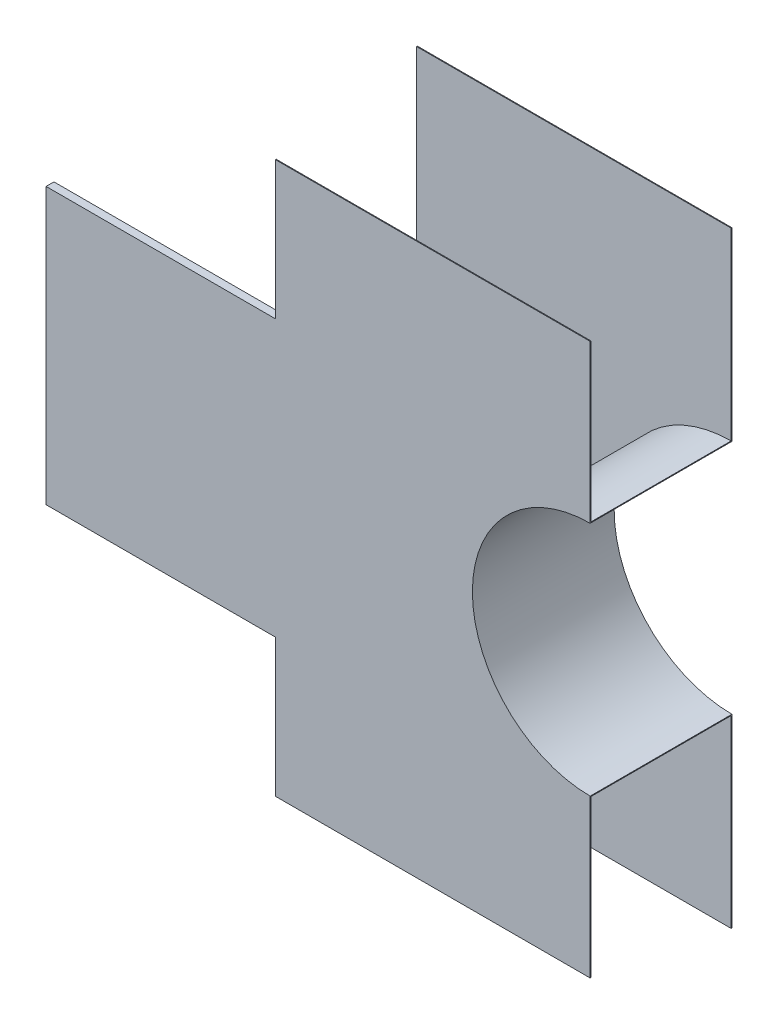
ISO-10303-21;
HEADER;
FILE_DESCRIPTION(('STEP AP214'),'2;1');
FILE_NAME('part.step','',(''),(''),'','','');
FILE_SCHEMA(('AUTOMOTIVE_DESIGN { 1 0 10303 214 1 1 1 1 }'));
ENDSEC;
DATA;
#1=APPLICATION_CONTEXT('core data for automotive mechanical design processes');
#2=APPLICATION_PROTOCOL_DEFINITION('international standard','automotive_design',2000,#1);
#3=PRODUCT_CONTEXT('',#1,'mechanical');
#4=PRODUCT('Part','Part','',(#3));
#5=PRODUCT_RELATED_PRODUCT_CATEGORY('part','',(#4));
#6=PRODUCT_DEFINITION_FORMATION('','',#4);
#7=PRODUCT_DEFINITION_CONTEXT('part definition',#1,'design');
#8=PRODUCT_DEFINITION('design','',#6,#7);
#9=PRODUCT_DEFINITION_SHAPE('','',#8);
#10=(LENGTH_UNIT() NAMED_UNIT(*) SI_UNIT(.MILLI.,.METRE.));
#11=(NAMED_UNIT(*) PLANE_ANGLE_UNIT() SI_UNIT($,.RADIAN.));
#12=(NAMED_UNIT(*) SI_UNIT($,.STERADIAN.) SOLID_ANGLE_UNIT());
#13=UNCERTAINTY_MEASURE_WITH_UNIT(LENGTH_MEASURE(1.E-05),#10,'distance_accuracy_value','');
#14=(GEOMETRIC_REPRESENTATION_CONTEXT(3) GLOBAL_UNCERTAINTY_ASSIGNED_CONTEXT((#13)) GLOBAL_UNIT_ASSIGNED_CONTEXT((#10,
#11,#12)) REPRESENTATION_CONTEXT('',''));
#15=CARTESIAN_POINT('',(0.,0.,0.));
#16=DIRECTION('',(0.,0.,1.));
#17=DIRECTION('',(1.,0.,0.));
#18=AXIS2_PLACEMENT_3D('',#15,#16,#17);
#19=CARTESIAN_POINT('',(-0.2,0.385,0.));
#20=DIRECTION('',(-1.,0.,0.));
#21=DIRECTION('',(0.,1.,0.));
#22=AXIS2_PLACEMENT_3D('',#19,#20,#21);
#23=PLANE('',#22);
#24=DIRECTION('',(0.,1.,0.));
#25=VECTOR('',#24,1.);
#26=CARTESIAN_POINT('',(-0.2,0.1925,0.001));
#27=LINE('',#26,#25);
#28=CARTESIAN_POINT('',(-0.2,-0.385,0.001));
#29=VERTEX_POINT('',#28);
#30=CARTESIAN_POINT('',(-0.2,0.385,0.001));
#31=VERTEX_POINT('',#30);
#32=EDGE_CURVE('E322',#29,#31,#27,.T.);
#33=ORIENTED_EDGE('',*,*,#32,.T.);
#34=DIRECTION('',(0.,0.,1.));
#35=VECTOR('',#34,1.);
#36=CARTESIAN_POINT('',(-0.2,0.385,0.));
#37=LINE('',#36,#35);
#38=CARTESIAN_POINT('',(-0.2,0.385,0.));
#39=VERTEX_POINT('',#38);
#40=EDGE_CURVE('E336',#39,#31,#37,.T.);
#41=ORIENTED_EDGE('',*,*,#40,.F.);
#42=DIRECTION('',(0.,1.,0.));
#43=VECTOR('',#42,1.);
#44=CARTESIAN_POINT('',(-0.2,-0.385,0.));
#45=LINE('',#44,#43);
#46=CARTESIAN_POINT('',(-0.2,-0.385,0.));
#47=VERTEX_POINT('',#46);
#48=EDGE_CURVE('E25',#47,#39,#45,.T.);
#49=ORIENTED_EDGE('',*,*,#48,.F.);
#50=DIRECTION('',(0.,0.,1.));
#51=VECTOR('',#50,1.);
#52=CARTESIAN_POINT('',(-0.2,-0.385,0.));
#53=LINE('',#52,#51);
#54=EDGE_CURVE('E11',#47,#29,#53,.T.);
#55=ORIENTED_EDGE('',*,*,#54,.T.);
#56=EDGE_LOOP('',(#33,#41,#49,#55));
#57=FACE_BOUND('',#56,.T.);
#58=ADVANCED_FACE('F17',(#57),#23,.T.);
#59=CARTESIAN_POINT('',(-0.2,-0.385,0.));
#60=DIRECTION('',(0.,-1.,0.));
#61=DIRECTION('',(-1.,0.,0.));
#62=AXIS2_PLACEMENT_3D('',#59,#60,#61);
#63=PLANE('',#62);
#64=DIRECTION('',(-1.,0.,0.));
#65=VECTOR('',#64,1.);
#66=CARTESIAN_POINT('',(-0.104818284477,-0.385,0.001));
#67=LINE('',#66,#65);
#68=CARTESIAN_POINT('',(0.1995,-0.385,0.001));
#69=VERTEX_POINT('',#68);
#70=EDGE_CURVE('E278',#69,#29,#67,.T.);
#71=ORIENTED_EDGE('',*,*,#70,.T.);
#72=ORIENTED_EDGE('',*,*,#54,.F.);
#73=DIRECTION('',(-1.,0.,0.));
#74=VECTOR('',#73,1.);
#75=CARTESIAN_POINT('',(0.2,-0.385,0.));
#76=LINE('',#75,#74);
#77=CARTESIAN_POINT('',(0.1995,-0.385,0.));
#78=VERTEX_POINT('',#77);
#79=EDGE_CURVE('E338',#78,#47,#76,.T.);
#80=ORIENTED_EDGE('',*,*,#79,.F.);
#81=DIRECTION('',(0.,0.,1.));
#82=VECTOR('',#81,1.);
#83=CARTESIAN_POINT('',(0.1995,-0.385,0.));
#84=LINE('',#83,#82);
#85=EDGE_CURVE('E287',#78,#69,#84,.T.);
#86=ORIENTED_EDGE('',*,*,#85,.T.);
#87=EDGE_LOOP('',(#71,#72,#80,#86));
#88=FACE_BOUND('',#87,.T.);
#89=ADVANCED_FACE('F400',(#88),#63,.T.);
#90=CARTESIAN_POINT('',(-0.009636568954392,0.,0.));
#91=DIRECTION('',(0.,0.,1.));
#92=DIRECTION('',(1.,0.,0.));
#93=AXIS2_PLACEMENT_3D('',#90,#91,#92);
#94=PLANE('',#93);
#95=DIRECTION('',(0.,-1.,0.));
#96=VECTOR('',#95,1.);
#97=CARTESIAN_POINT('',(0.1995,0.2,0.));
#98=LINE('',#97,#96);
#99=CARTESIAN_POINT('',(0.1995,-0.149999166664,0.));
#100=VERTEX_POINT('',#99);
#101=EDGE_CURVE('E283',#100,#78,#98,.T.);
#102=ORIENTED_EDGE('',*,*,#101,.T.);
#103=ORIENTED_EDGE('',*,*,#79,.T.);
#104=ORIENTED_EDGE('',*,*,#48,.T.);
#105=DIRECTION('',(1.,0.,0.));
#106=VECTOR('',#105,1.);
#107=CARTESIAN_POINT('',(-0.2,0.385,0.));
#108=LINE('',#107,#106);
#109=CARTESIAN_POINT('',(0.1995,0.385,0.));
#110=VERTEX_POINT('',#109);
#111=EDGE_CURVE('E226',#39,#110,#108,.T.);
#112=ORIENTED_EDGE('',*,*,#111,.T.);
#113=DIRECTION('',(0.,-1.,0.));
#114=VECTOR('',#113,1.);
#115=CARTESIAN_POINT('',(0.1995,0.2,0.));
#116=LINE('',#115,#114);
#117=CARTESIAN_POINT('',(0.1995,0.149999166664,0.));
#118=VERTEX_POINT('',#117);
#119=EDGE_CURVE('E330',#110,#118,#116,.T.);
#120=ORIENTED_EDGE('',*,*,#119,.T.);
#121=CARTESIAN_POINT('',(0.2,0.,0.));
#122=DIRECTION('',(0.,0.,1.));
#123=DIRECTION('',(0.,1.,0.));
#124=AXIS2_PLACEMENT_3D('',#121,#122,#123);
#125=CIRCLE('',#124,0.15);
#126=EDGE_CURVE('E223',#118,#100,#125,.T.);
#127=ORIENTED_EDGE('',*,*,#126,.T.);
#128=EDGE_LOOP('',(#102,#103,#104,#112,#120,#127));
#129=FACE_BOUND('',#128,.T.);
#130=ADVANCED_FACE('F386',(#129),#94,.F.);
#131=CARTESIAN_POINT('',(0.2,0.385,0.));
#132=DIRECTION('',(0.,1.,0.));
#133=DIRECTION('',(1.,0.,0.));
#134=AXIS2_PLACEMENT_3D('',#131,#132,#133);
#135=PLANE('',#134);
#136=DIRECTION('',(1.,0.,0.));
#137=VECTOR('',#136,1.);
#138=CARTESIAN_POINT('',(0.0951817155228,0.385,0.001));
#139=LINE('',#138,#137);
#140=CARTESIAN_POINT('',(0.1995,0.385,0.001));
#141=VERTEX_POINT('',#140);
#142=EDGE_CURVE('E255',#31,#141,#139,.T.);
#143=ORIENTED_EDGE('',*,*,#142,.T.);
#144=DIRECTION('',(0.,0.,-1.));
#145=VECTOR('',#144,1.);
#146=CARTESIAN_POINT('',(0.1995,0.385,0.));
#147=LINE('',#146,#145);
#148=EDGE_CURVE('E227',#141,#110,#147,.T.);
#149=ORIENTED_EDGE('',*,*,#148,.T.);
#150=ORIENTED_EDGE('',*,*,#111,.F.);
#151=ORIENTED_EDGE('',*,*,#40,.T.);
#152=EDGE_LOOP('',(#143,#149,#150,#151));
#153=FACE_BOUND('',#152,.T.);
#154=ADVANCED_FACE('F408',(#153),#135,.T.);
#155=CARTESIAN_POINT('',(0.2,0.,0.));
#156=DIRECTION('',(0.,0.,1.));
#157=DIRECTION('',(0.,1.,0.));
#158=AXIS2_PLACEMENT_3D('',#155,#156,#157);
#159=CYLINDRICAL_SURFACE('',#158,0.15);
#160=DIRECTION('',(0.,0.,-1.));
#161=VECTOR('',#160,1.);
#162=CARTESIAN_POINT('',(0.1995,-0.149999166664,0.));
#163=LINE('',#162,#161);
#164=CARTESIAN_POINT('',(0.1995,-0.149999166664,0.18));
#165=VERTEX_POINT('',#164);
#166=EDGE_CURVE('E282',#165,#100,#163,.T.);
#167=ORIENTED_EDGE('',*,*,#166,.T.);
#168=ORIENTED_EDGE('',*,*,#126,.F.);
#169=DIRECTION('',(0.,0.,1.));
#170=VECTOR('',#169,1.);
#171=CARTESIAN_POINT('',(0.1995,0.149999166664,0.));
#172=LINE('',#171,#170);
#173=CARTESIAN_POINT('',(0.1995,0.149999166664,0.18));
#174=VERTEX_POINT('',#173);
#175=EDGE_CURVE('E277',#118,#174,#172,.T.);
#176=ORIENTED_EDGE('',*,*,#175,.T.);
#177=CARTESIAN_POINT('',(0.2,0.,0.18));
#178=DIRECTION('',(0.,0.,-1.));
#179=DIRECTION('',(0.,1.,0.));
#180=AXIS2_PLACEMENT_3D('',#177,#178,#179);
#181=CIRCLE('',#180,0.15);
#182=EDGE_CURVE('E252',#165,#174,#181,.T.);
#183=ORIENTED_EDGE('',*,*,#182,.F.);
#184=EDGE_LOOP('',(#167,#168,#176,#183));
#185=FACE_BOUND('',#184,.T.);
#186=ADVANCED_FACE('F393',(#185),#159,.F.);
#187=CARTESIAN_POINT('',(0.1995,0.4,0.));
#188=DIRECTION('',(-1.,0.,0.));
#189=DIRECTION('',(0.,0.,1.));
#190=AXIS2_PLACEMENT_3D('',#187,#188,#189);
#191=PLANE('',#190);
#192=DIRECTION('',(0.,0.,1.));
#193=VECTOR('',#192,1.);
#194=CARTESIAN_POINT('',(0.1995,0.35,0.09));
#195=LINE('',#194,#193);
#196=CARTESIAN_POINT('',(0.1995,0.35,0.179));
#197=VERTEX_POINT('',#196);
#198=CARTESIAN_POINT('',(0.1995,0.35,0.18));
#199=VERTEX_POINT('',#198);
#200=EDGE_CURVE('E291',#197,#199,#195,.T.);
#201=ORIENTED_EDGE('',*,*,#200,.T.);
#202=DIRECTION('',(0.,1.,0.));
#203=VECTOR('',#202,1.);
#204=CARTESIAN_POINT('',(0.1995,0.2,0.18));
#205=LINE('',#204,#203);
#206=EDGE_CURVE('E259',#174,#199,#205,.T.);
#207=ORIENTED_EDGE('',*,*,#206,.F.);
#208=ORIENTED_EDGE('',*,*,#175,.F.);
#209=ORIENTED_EDGE('',*,*,#119,.F.);
#210=ORIENTED_EDGE('',*,*,#148,.F.);
#211=DIRECTION('',(0.,-1.,0.));
#212=VECTOR('',#211,1.);
#213=CARTESIAN_POINT('',(0.1995,0.2,0.001));
#214=LINE('',#213,#212);
#215=CARTESIAN_POINT('',(0.1995,0.150999172208,0.001));
#216=VERTEX_POINT('',#215);
#217=EDGE_CURVE('E247',#141,#216,#214,.T.);
#218=ORIENTED_EDGE('',*,*,#217,.T.);
#219=DIRECTION('',(0.,0.,1.));
#220=VECTOR('',#219,1.);
#221=CARTESIAN_POINT('',(0.1995,0.150999172183,0.));
#222=LINE('',#221,#220);
#223=CARTESIAN_POINT('',(0.1995,0.150999172208,0.179));
#224=VERTEX_POINT('',#223);
#225=EDGE_CURVE('E248',#216,#224,#222,.T.);
#226=ORIENTED_EDGE('',*,*,#225,.T.);
#227=DIRECTION('',(0.,1.,0.));
#228=VECTOR('',#227,1.);
#229=CARTESIAN_POINT('',(0.1995,0.2,0.179));
#230=LINE('',#229,#228);
#231=EDGE_CURVE('E274',#224,#197,#230,.T.);
#232=ORIENTED_EDGE('',*,*,#231,.T.);
#233=EDGE_LOOP('',(#201,#207,#208,#209,#210,#218,#226,#232));
#234=FACE_BOUND('',#233,.T.);
#235=ADVANCED_FACE('F390',(#234),#191,.F.);
#236=CARTESIAN_POINT('',(-0.009636568954392,0.,0.179));
#237=DIRECTION('',(0.,0.,1.));
#238=DIRECTION('',(1.,0.,0.));
#239=AXIS2_PLACEMENT_3D('',#236,#237,#238);
#240=PLANE('',#239);
#241=DIRECTION('',(-1.,0.,0.));
#242=VECTOR('',#241,1.);
#243=CARTESIAN_POINT('',(-0.250445031209,0.175,0.179));
#244=LINE('',#243,#242);
#245=CARTESIAN_POINT('',(-0.09125349346398,0.175,0.179));
#246=VERTEX_POINT('',#245);
#247=CARTESIAN_POINT('',(-0.2,0.175,0.179));
#248=VERTEX_POINT('',#247);
#249=EDGE_CURVE('E350',#246,#248,#244,.T.);
#250=ORIENTED_EDGE('',*,*,#249,.T.);
#251=DIRECTION('',(0.,-1.,0.));
#252=VECTOR('',#251,1.);
#253=CARTESIAN_POINT('',(-0.2,0.1925,0.179));
#254=LINE('',#253,#252);
#255=CARTESIAN_POINT('',(-0.2,0.35,0.179));
#256=VERTEX_POINT('',#255);
#257=EDGE_CURVE('E301',#256,#248,#254,.T.);
#258=ORIENTED_EDGE('',*,*,#257,.F.);
#259=DIRECTION('',(1.,0.,0.));
#260=VECTOR('',#259,1.);
#261=CARTESIAN_POINT('',(0.09493171552281,0.35,0.179));
#262=LINE('',#261,#260);
#263=EDGE_CURVE('E269',#256,#197,#262,.T.);
#264=ORIENTED_EDGE('',*,*,#263,.T.);
#265=ORIENTED_EDGE('',*,*,#231,.F.);
#266=CARTESIAN_POINT('',(0.2,0.,0.179));
#267=DIRECTION('',(0.,0.,1.));
#268=DIRECTION('',(0.,1.,0.));
#269=AXIS2_PLACEMENT_3D('',#266,#267,#268);
#270=CIRCLE('',#269,0.151);
#271=CARTESIAN_POINT('',(0.1995,-0.150999172208,0.179));
#272=VERTEX_POINT('',#271);
#273=EDGE_CURVE('E279',#224,#272,#270,.T.);
#274=ORIENTED_EDGE('',*,*,#273,.T.);
#275=DIRECTION('',(0.,1.,0.));
#276=VECTOR('',#275,1.);
#277=CARTESIAN_POINT('',(0.1995,0.2,0.179));
#278=LINE('',#277,#276);
#279=CARTESIAN_POINT('',(0.1995,-0.35,0.179));
#280=VERTEX_POINT('',#279);
#281=EDGE_CURVE('E304',#280,#272,#278,.T.);
#282=ORIENTED_EDGE('',*,*,#281,.F.);
#283=DIRECTION('',(-1.,0.,0.));
#284=VECTOR('',#283,1.);
#285=CARTESIAN_POINT('',(-0.104818284477,-0.35,0.179));
#286=LINE('',#285,#284);
#287=CARTESIAN_POINT('',(-0.2,-0.35,0.179));
#288=VERTEX_POINT('',#287);
#289=EDGE_CURVE('E294',#280,#288,#286,.T.);
#290=ORIENTED_EDGE('',*,*,#289,.T.);
#291=DIRECTION('',(0.,-1.,0.));
#292=VECTOR('',#291,1.);
#293=CARTESIAN_POINT('',(-0.2,0.1925,0.179));
#294=LINE('',#293,#292);
#295=CARTESIAN_POINT('',(-0.2,-0.175,0.179));
#296=VERTEX_POINT('',#295);
#297=EDGE_CURVE('E230',#296,#288,#294,.T.);
#298=ORIENTED_EDGE('',*,*,#297,.F.);
#299=DIRECTION('',(1.,0.,0.));
#300=VECTOR('',#299,1.);
#301=CARTESIAN_POINT('',(-0.05044503120919,-0.175,0.179));
#302=LINE('',#301,#300);
#303=CARTESIAN_POINT('',(-0.09125349346398,-0.175,0.179));
#304=VERTEX_POINT('',#303);
#305=EDGE_CURVE('E192',#296,#304,#302,.T.);
#306=ORIENTED_EDGE('',*,*,#305,.T.);
#307=DIRECTION('',(0.,1.,0.));
#308=VECTOR('',#307,1.);
#309=CARTESIAN_POINT('',(-0.09125349346398,0.0875,0.179));
#310=LINE('',#309,#308);
#311=EDGE_CURVE('E378',#304,#246,#310,.T.);
#312=ORIENTED_EDGE('',*,*,#311,.T.);
#313=EDGE_LOOP('',(#250,#258,#264,#265,#274,#282,#290,#298,#306,#312));
#314=FACE_BOUND('',#313,.T.);
#315=ADVANCED_FACE('F416',(#314),#240,.F.);
#316=CARTESIAN_POINT('',(-0.009636568954392,0.,0.001));
#317=DIRECTION('',(0.,0.,1.));
#318=DIRECTION('',(1.,0.,0.));
#319=AXIS2_PLACEMENT_3D('',#316,#317,#318);
#320=PLANE('',#319);
#321=DIRECTION('',(0.,-1.,0.));
#322=VECTOR('',#321,1.);
#323=CARTESIAN_POINT('',(0.1995,0.2,0.001));
#324=LINE('',#323,#322);
#325=CARTESIAN_POINT('',(0.1995,-0.150999172208,0.001));
#326=VERTEX_POINT('',#325);
#327=EDGE_CURVE('E312',#326,#69,#324,.T.);
#328=ORIENTED_EDGE('',*,*,#327,.F.);
#329=CARTESIAN_POINT('',(0.2,0.,0.001));
#330=DIRECTION('',(0.,0.,1.));
#331=DIRECTION('',(0.,1.,0.));
#332=AXIS2_PLACEMENT_3D('',#329,#330,#331);
#333=CIRCLE('',#332,0.151);
#334=EDGE_CURVE('E244',#216,#326,#333,.T.);
#335=ORIENTED_EDGE('',*,*,#334,.F.);
#336=ORIENTED_EDGE('',*,*,#217,.F.);
#337=ORIENTED_EDGE('',*,*,#142,.F.);
#338=ORIENTED_EDGE('',*,*,#32,.F.);
#339=ORIENTED_EDGE('',*,*,#70,.F.);
#340=EDGE_LOOP('',(#328,#335,#336,#337,#338,#339));
#341=FACE_BOUND('',#340,.T.);
#342=ADVANCED_FACE('F404',(#341),#320,.T.);
#343=CARTESIAN_POINT('',(0.2,0.,0.));
#344=DIRECTION('',(0.,0.,1.));
#345=DIRECTION('',(0.,1.,0.));
#346=AXIS2_PLACEMENT_3D('',#343,#344,#345);
#347=CYLINDRICAL_SURFACE('',#346,0.151);
#348=DIRECTION('',(0.,0.,-1.));
#349=VECTOR('',#348,1.);
#350=CARTESIAN_POINT('',(0.1995,-0.150999172183,0.));
#351=LINE('',#350,#349);
#352=EDGE_CURVE('E308',#272,#326,#351,.T.);
#353=ORIENTED_EDGE('',*,*,#352,.F.);
#354=ORIENTED_EDGE('',*,*,#273,.F.);
#355=ORIENTED_EDGE('',*,*,#225,.F.);
#356=ORIENTED_EDGE('',*,*,#334,.T.);
#357=EDGE_LOOP('',(#353,#354,#355,#356));
#358=FACE_BOUND('',#357,.T.);
#359=ADVANCED_FACE('F414',(#358),#347,.T.);
#360=CARTESIAN_POINT('',(0.1995,0.4,0.));
#361=DIRECTION('',(-1.,0.,0.));
#362=DIRECTION('',(0.,0.,1.));
#363=AXIS2_PLACEMENT_3D('',#360,#361,#362);
#364=PLANE('',#363);
#365=DIRECTION('',(0.,0.,-1.));
#366=VECTOR('',#365,1.);
#367=CARTESIAN_POINT('',(0.1995,-0.35,0.09));
#368=LINE('',#367,#366);
#369=CARTESIAN_POINT('',(0.1995,-0.35,0.18));
#370=VERTEX_POINT('',#369);
#371=EDGE_CURVE('E297',#370,#280,#368,.T.);
#372=ORIENTED_EDGE('',*,*,#371,.T.);
#373=ORIENTED_EDGE('',*,*,#281,.T.);
#374=ORIENTED_EDGE('',*,*,#352,.T.);
#375=ORIENTED_EDGE('',*,*,#327,.T.);
#376=ORIENTED_EDGE('',*,*,#85,.F.);
#377=ORIENTED_EDGE('',*,*,#101,.F.);
#378=ORIENTED_EDGE('',*,*,#166,.F.);
#379=DIRECTION('',(0.,1.,0.));
#380=VECTOR('',#379,1.);
#381=CARTESIAN_POINT('',(0.1995,0.2,0.18));
#382=LINE('',#381,#380);
#383=EDGE_CURVE('E243',#370,#165,#382,.T.);
#384=ORIENTED_EDGE('',*,*,#383,.F.);
#385=EDGE_LOOP('',(#372,#373,#374,#375,#376,#377,#378,#384));
#386=FACE_BOUND('',#385,.T.);
#387=ADVANCED_FACE('F398',(#386),#364,.F.);
#388=CARTESIAN_POINT('',(-0.2,0.385,0.));
#389=DIRECTION('',(-1.,0.,0.));
#390=DIRECTION('',(0.,1.,0.));
#391=AXIS2_PLACEMENT_3D('',#388,#389,#390);
#392=PLANE('',#391);
#393=DIRECTION('',(0.,0.,1.));
#394=VECTOR('',#393,1.);
#395=CARTESIAN_POINT('',(-0.2,0.175,0.09));
#396=LINE('',#395,#394);
#397=CARTESIAN_POINT('',(-0.2,0.175,0.18));
#398=VERTEX_POINT('',#397);
#399=EDGE_CURVE('E355',#248,#398,#396,.T.);
#400=ORIENTED_EDGE('',*,*,#399,.T.);
#401=DIRECTION('',(0.,-1.,0.));
#402=VECTOR('',#401,1.);
#403=CARTESIAN_POINT('',(-0.2,-0.385,0.18));
#404=LINE('',#403,#402);
#405=CARTESIAN_POINT('',(-0.2,0.35,0.18));
#406=VERTEX_POINT('',#405);
#407=EDGE_CURVE('E228',#406,#398,#404,.T.);
#408=ORIENTED_EDGE('',*,*,#407,.F.);
#409=DIRECTION('',(0.,0.,-1.));
#410=VECTOR('',#409,1.);
#411=CARTESIAN_POINT('',(-0.2,0.35,0.09));
#412=LINE('',#411,#410);
#413=EDGE_CURVE('E273',#406,#256,#412,.T.);
#414=ORIENTED_EDGE('',*,*,#413,.T.);
#415=ORIENTED_EDGE('',*,*,#257,.T.);
#416=EDGE_LOOP('',(#400,#408,#414,#415));
#417=FACE_BOUND('',#416,.T.);
#418=ADVANCED_FACE('F481',(#417),#392,.T.);
#419=CARTESIAN_POINT('',(-0.2,-0.35,0.18));
#420=DIRECTION('',(0.,1.,0.));
#421=DIRECTION('',(1.,0.,0.));
#422=AXIS2_PLACEMENT_3D('',#419,#420,#421);
#423=PLANE('',#422);
#424=ORIENTED_EDGE('',*,*,#289,.F.);
#425=ORIENTED_EDGE('',*,*,#371,.F.);
#426=DIRECTION('',(1.,0.,0.));
#427=VECTOR('',#426,1.);
#428=CARTESIAN_POINT('',(-0.104818284477,-0.35,0.18));
#429=LINE('',#428,#427);
#430=CARTESIAN_POINT('',(-0.2,-0.35,0.18));
#431=VERTEX_POINT('',#430);
#432=EDGE_CURVE('E239',#431,#370,#429,.T.);
#433=ORIENTED_EDGE('',*,*,#432,.F.);
#434=DIRECTION('',(0.,0.,1.));
#435=VECTOR('',#434,1.);
#436=CARTESIAN_POINT('',(-0.2,-0.35,0.09));
#437=LINE('',#436,#435);
#438=EDGE_CURVE('E266',#288,#431,#437,.T.);
#439=ORIENTED_EDGE('',*,*,#438,.F.);
#440=EDGE_LOOP('',(#424,#425,#433,#439));
#441=FACE_BOUND('',#440,.T.);
#442=ADVANCED_FACE('F429',(#441),#423,.F.);
#443=CARTESIAN_POINT('',(0.1995,0.35,0.18));
#444=DIRECTION('',(0.,-1.,0.));
#445=DIRECTION('',(0.,0.,-1.));
#446=AXIS2_PLACEMENT_3D('',#443,#444,#445);
#447=PLANE('',#446);
#448=ORIENTED_EDGE('',*,*,#263,.F.);
#449=ORIENTED_EDGE('',*,*,#413,.F.);
#450=DIRECTION('',(-1.,0.,0.));
#451=VECTOR('',#450,1.);
#452=CARTESIAN_POINT('',(0.09493171552281,0.35,0.18));
#453=LINE('',#452,#451);
#454=EDGE_CURVE('E231',#199,#406,#453,.T.);
#455=ORIENTED_EDGE('',*,*,#454,.F.);
#456=ORIENTED_EDGE('',*,*,#200,.F.);
#457=EDGE_LOOP('',(#448,#449,#455,#456));
#458=FACE_BOUND('',#457,.T.);
#459=ADVANCED_FACE('F421',(#458),#447,.F.);
#460=CARTESIAN_POINT('',(-0.2,0.385,0.));
#461=DIRECTION('',(-1.,0.,0.));
#462=DIRECTION('',(0.,1.,0.));
#463=AXIS2_PLACEMENT_3D('',#460,#461,#462);
#464=PLANE('',#463);
#465=DIRECTION('',(0.,0.,-1.));
#466=VECTOR('',#465,1.);
#467=CARTESIAN_POINT('',(-0.2,-0.175,0.09));
#468=LINE('',#467,#466);
#469=CARTESIAN_POINT('',(-0.2,-0.175,0.18));
#470=VERTEX_POINT('',#469);
#471=EDGE_CURVE('E203',#470,#296,#468,.T.);
#472=ORIENTED_EDGE('',*,*,#471,.T.);
#473=ORIENTED_EDGE('',*,*,#297,.T.);
#474=ORIENTED_EDGE('',*,*,#438,.T.);
#475=DIRECTION('',(0.,-1.,0.));
#476=VECTOR('',#475,1.);
#477=CARTESIAN_POINT('',(-0.2,-0.385,0.18));
#478=LINE('',#477,#476);
#479=EDGE_CURVE('E235',#470,#431,#478,.T.);
#480=ORIENTED_EDGE('',*,*,#479,.F.);
#481=EDGE_LOOP('',(#472,#473,#474,#480));
#482=FACE_BOUND('',#481,.T.);
#483=ADVANCED_FACE('F433',(#482),#464,.T.);
#484=CARTESIAN_POINT('',(-0.009636568954392,0.,0.18));
#485=DIRECTION('',(0.,0.,1.));
#486=DIRECTION('',(1.,0.,0.));
#487=AXIS2_PLACEMENT_3D('',#484,#485,#486);
#488=PLANE('',#487);
#489=ORIENTED_EDGE('',*,*,#479,.T.);
#490=ORIENTED_EDGE('',*,*,#432,.T.);
#491=ORIENTED_EDGE('',*,*,#383,.T.);
#492=ORIENTED_EDGE('',*,*,#182,.T.);
#493=ORIENTED_EDGE('',*,*,#206,.T.);
#494=ORIENTED_EDGE('',*,*,#454,.T.);
#495=ORIENTED_EDGE('',*,*,#407,.T.);
#496=DIRECTION('',(1.,0.,0.));
#497=VECTOR('',#496,1.);
#498=CARTESIAN_POINT('',(-0.491253493464,0.175,0.18));
#499=LINE('',#498,#497);
#500=CARTESIAN_POINT('',(-0.491253493464,0.175,0.18));
#501=VERTEX_POINT('',#500);
#502=EDGE_CURVE('E348',#501,#398,#499,.T.);
#503=ORIENTED_EDGE('',*,*,#502,.F.);
#504=DIRECTION('',(0.,1.,0.));
#505=VECTOR('',#504,1.);
#506=CARTESIAN_POINT('',(-0.491253493464,-0.175,0.18));
#507=LINE('',#506,#505);
#508=CARTESIAN_POINT('',(-0.491253493464,-0.175,0.18));
#509=VERTEX_POINT('',#508);
#510=EDGE_CURVE('E210',#509,#501,#507,.T.);
#511=ORIENTED_EDGE('',*,*,#510,.F.);
#512=DIRECTION('',(-1.,0.,0.));
#513=VECTOR('',#512,1.);
#514=CARTESIAN_POINT('',(-0.09125349346398,-0.175,0.18));
#515=LINE('',#514,#513);
#516=EDGE_CURVE('E193',#470,#509,#515,.T.);
#517=ORIENTED_EDGE('',*,*,#516,.F.);
#518=EDGE_LOOP('',(#489,#490,#491,#492,#493,#494,#495,#503,#511,#517));
#519=FACE_BOUND('',#518,.T.);
#520=ADVANCED_FACE('F424',(#519),#488,.T.);
#521=CARTESIAN_POINT('',(-0.291253493464,0.,0.17));
#522=DIRECTION('',(0.,0.,-1.));
#523=DIRECTION('',(0.,-1.,0.));
#524=AXIS2_PLACEMENT_3D('',#521,#522,#523);
#525=PLANE('',#524);
#526=DIRECTION('',(-1.,0.,0.));
#527=VECTOR('',#526,1.);
#528=CARTESIAN_POINT('',(-0.09125349346398,-0.175,0.17));
#529=LINE('',#528,#527);
#530=CARTESIAN_POINT('',(-0.09125349346398,-0.175,0.17));
#531=VERTEX_POINT('',#530);
#532=CARTESIAN_POINT('',(-0.491253493464,-0.175,0.17));
#533=VERTEX_POINT('',#532);
#534=EDGE_CURVE('E180',#531,#533,#529,.T.);
#535=ORIENTED_EDGE('',*,*,#534,.T.);
#536=DIRECTION('',(0.,1.,0.));
#537=VECTOR('',#536,1.);
#538=CARTESIAN_POINT('',(-0.491253493464,-0.175,0.17));
#539=LINE('',#538,#537);
#540=CARTESIAN_POINT('',(-0.491253493464,0.175,0.17));
#541=VERTEX_POINT('',#540);
#542=EDGE_CURVE('E185',#533,#541,#539,.T.);
#543=ORIENTED_EDGE('',*,*,#542,.T.);
#544=DIRECTION('',(1.,0.,0.));
#545=VECTOR('',#544,1.);
#546=CARTESIAN_POINT('',(-0.491253493464,0.175,0.17));
#547=LINE('',#546,#545);
#548=CARTESIAN_POINT('',(-0.09125349346398,0.175,0.17));
#549=VERTEX_POINT('',#548);
#550=EDGE_CURVE('E358',#541,#549,#547,.T.);
#551=ORIENTED_EDGE('',*,*,#550,.T.);
#552=DIRECTION('',(0.,-1.,0.));
#553=VECTOR('',#552,1.);
#554=CARTESIAN_POINT('',(-0.09125349346398,0.175,0.17));
#555=LINE('',#554,#553);
#556=EDGE_CURVE('E187',#549,#531,#555,.T.);
#557=ORIENTED_EDGE('',*,*,#556,.T.);
#558=EDGE_LOOP('',(#535,#543,#551,#557));
#559=FACE_BOUND('',#558,.T.);
#560=ADVANCED_FACE('F182',(#559),#525,.T.);
#561=CARTESIAN_POINT('',(-0.09125349346398,-0.175,0.18));
#562=DIRECTION('',(0.,-1.,0.));
#563=DIRECTION('',(0.,0.,-1.));
#564=AXIS2_PLACEMENT_3D('',#561,#562,#563);
#565=PLANE('',#564);
#566=ORIENTED_EDGE('',*,*,#471,.F.);
#567=ORIENTED_EDGE('',*,*,#516,.T.);
#568=DIRECTION('',(0.,0.,-1.));
#569=VECTOR('',#568,1.);
#570=CARTESIAN_POINT('',(-0.491253493464,-0.175,0.18));
#571=LINE('',#570,#569);
#572=EDGE_CURVE('E196',#509,#533,#571,.T.);
#573=ORIENTED_EDGE('',*,*,#572,.T.);
#574=ORIENTED_EDGE('',*,*,#534,.F.);
#575=DIRECTION('',(0.,0.,-1.));
#576=VECTOR('',#575,1.);
#577=CARTESIAN_POINT('',(-0.09125349346398,-0.175,0.18));
#578=LINE('',#577,#576);
#579=EDGE_CURVE('E219',#304,#531,#578,.T.);
#580=ORIENTED_EDGE('',*,*,#579,.F.);
#581=ORIENTED_EDGE('',*,*,#305,.F.);
#582=EDGE_LOOP('',(#566,#567,#573,#574,#580,#581));
#583=FACE_BOUND('',#582,.T.);
#584=ADVANCED_FACE('F198',(#583),#565,.T.);
#585=CARTESIAN_POINT('',(-0.491253493464,-0.175,0.18));
#586=DIRECTION('',(-1.,0.,0.));
#587=DIRECTION('',(0.,0.,1.));
#588=AXIS2_PLACEMENT_3D('',#585,#586,#587);
#589=PLANE('',#588);
#590=ORIENTED_EDGE('',*,*,#510,.T.);
#591=DIRECTION('',(0.,0.,-1.));
#592=VECTOR('',#591,1.);
#593=CARTESIAN_POINT('',(-0.491253493464,0.175,0.18));
#594=LINE('',#593,#592);
#595=EDGE_CURVE('E207',#501,#541,#594,.T.);
#596=ORIENTED_EDGE('',*,*,#595,.T.);
#597=ORIENTED_EDGE('',*,*,#542,.F.);
#598=ORIENTED_EDGE('',*,*,#572,.F.);
#599=EDGE_LOOP('',(#590,#596,#597,#598));
#600=FACE_BOUND('',#599,.T.);
#601=ADVANCED_FACE('F205',(#600),#589,.T.);
#602=CARTESIAN_POINT('',(-0.09125349346398,0.175,0.18));
#603=DIRECTION('',(1.,0.,0.));
#604=DIRECTION('',(0.,1.,0.));
#605=AXIS2_PLACEMENT_3D('',#602,#603,#604);
#606=PLANE('',#605);
#607=ORIENTED_EDGE('',*,*,#311,.F.);
#608=ORIENTED_EDGE('',*,*,#579,.T.);
#609=ORIENTED_EDGE('',*,*,#556,.F.);
#610=DIRECTION('',(0.,0.,-1.));
#611=VECTOR('',#610,1.);
#612=CARTESIAN_POINT('',(-0.09125349346398,0.175,0.18));
#613=LINE('',#612,#611);
#614=EDGE_CURVE('E354',#246,#549,#613,.T.);
#615=ORIENTED_EDGE('',*,*,#614,.F.);
#616=EDGE_LOOP('',(#607,#608,#609,#615));
#617=FACE_BOUND('',#616,.T.);
#618=ADVANCED_FACE('F444',(#617),#606,.T.);
#619=CARTESIAN_POINT('',(-0.491253493464,0.175,0.18));
#620=DIRECTION('',(0.,1.,0.));
#621=DIRECTION('',(1.,0.,0.));
#622=AXIS2_PLACEMENT_3D('',#619,#620,#621);
#623=PLANE('',#622);
#624=ORIENTED_EDGE('',*,*,#399,.F.);
#625=ORIENTED_EDGE('',*,*,#249,.F.);
#626=ORIENTED_EDGE('',*,*,#614,.T.);
#627=ORIENTED_EDGE('',*,*,#550,.F.);
#628=ORIENTED_EDGE('',*,*,#595,.F.);
#629=ORIENTED_EDGE('',*,*,#502,.T.);
#630=EDGE_LOOP('',(#624,#625,#626,#627,#628,#629));
#631=FACE_BOUND('',#630,.T.);
#632=ADVANCED_FACE('F440',(#631),#623,.T.);
#633=CLOSED_SHELL('',(#58,#89,#130,#154,#186,#235,#315,#342,#359,#387,#418,#442,#459,#483,#520,
#560,#584,#601,#618,#632));
#634=MANIFOLD_SOLID_BREP('B1',#633);
#635=ADVANCED_BREP_SHAPE_REPRESENTATION('',(#18,#634),#14);
#636=SHAPE_DEFINITION_REPRESENTATION(#9,#635);
ENDSEC;
END-ISO-10303-21;
